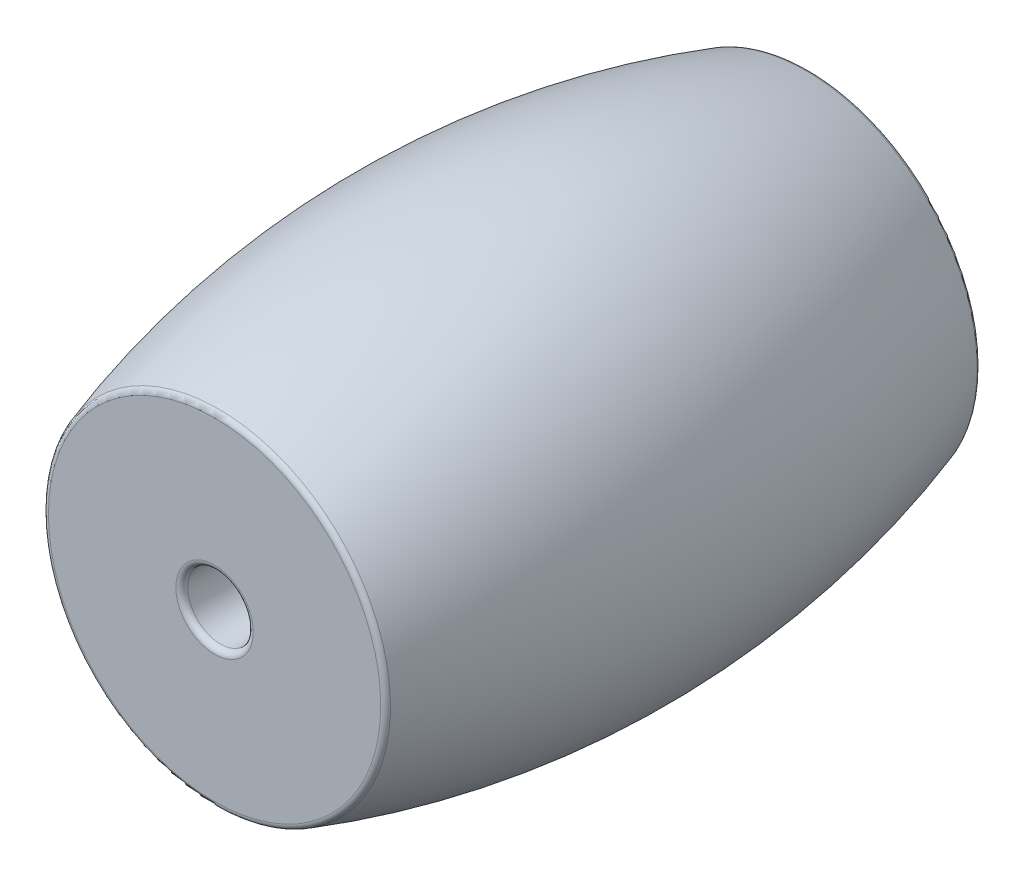
ISO-10303-21;
HEADER;
FILE_DESCRIPTION(('STEP AP214'),'2;1');
FILE_NAME('part.step','',(''),(''),'','','');
FILE_SCHEMA(('AUTOMOTIVE_DESIGN { 1 0 10303 214 1 1 1 1 }'));
ENDSEC;
DATA;
#1=APPLICATION_CONTEXT('core data for automotive mechanical design processes');
#2=APPLICATION_PROTOCOL_DEFINITION('international standard','automotive_design',2000,#1);
#3=PRODUCT_CONTEXT('',#1,'mechanical');
#4=PRODUCT('Part','Part','',(#3));
#5=PRODUCT_RELATED_PRODUCT_CATEGORY('part','',(#4));
#6=PRODUCT_DEFINITION_FORMATION('','',#4);
#7=PRODUCT_DEFINITION_CONTEXT('part definition',#1,'design');
#8=PRODUCT_DEFINITION('design','',#6,#7);
#9=PRODUCT_DEFINITION_SHAPE('','',#8);
#10=(LENGTH_UNIT() NAMED_UNIT(*) SI_UNIT(.MILLI.,.METRE.));
#11=(NAMED_UNIT(*) PLANE_ANGLE_UNIT() SI_UNIT($,.RADIAN.));
#12=(NAMED_UNIT(*) SI_UNIT($,.STERADIAN.) SOLID_ANGLE_UNIT());
#13=UNCERTAINTY_MEASURE_WITH_UNIT(LENGTH_MEASURE(1.E-05),#10,'distance_accuracy_value','');
#14=(GEOMETRIC_REPRESENTATION_CONTEXT(3) GLOBAL_UNCERTAINTY_ASSIGNED_CONTEXT((#13)) GLOBAL_UNIT_ASSIGNED_CONTEXT((#10,
#11,#12)) REPRESENTATION_CONTEXT('',''));
#15=CARTESIAN_POINT('',(0.,0.,0.));
#16=DIRECTION('',(0.,0.,1.));
#17=DIRECTION('',(1.,0.,0.));
#18=AXIS2_PLACEMENT_3D('',#15,#16,#17);
#19=CARTESIAN_POINT('',(0.,0.,-15.));
#20=DIRECTION('',(0.,0.,-1.));
#21=DIRECTION('',(-1.,0.,0.));
#22=AXIS2_PLACEMENT_3D('',#19,#20,#21);
#23=PLANE('',#22);
#24=CARTESIAN_POINT('',(0.,0.,-15.));
#25=DIRECTION('',(0.,0.,-1.));
#26=DIRECTION('',(-1.,0.,0.));
#27=AXIS2_PLACEMENT_3D('',#24,#25,#26);
#28=CIRCLE('',#27,1.95);
#29=CARTESIAN_POINT('',(-1.95,0.,-15.));
#30=VERTEX_POINT('',#29);
#31=EDGE_CURVE('E47',#30,#30,#28,.F.);
#32=ORIENTED_EDGE('',*,*,#31,.T.);
#33=EDGE_LOOP('',(#32));
#34=FACE_BOUND('',#33,.T.);
#35=CARTESIAN_POINT('',(0.,0.,-15.));
#36=DIRECTION('',(0.,0.,-1.));
#37=DIRECTION('',(-1.,0.,0.));
#38=AXIS2_PLACEMENT_3D('',#35,#36,#37);
#39=CIRCLE('',#38,8.3784089628537);
#40=CARTESIAN_POINT('',(-8.3784089628537,0.,-15.));
#41=VERTEX_POINT('',#40);
#42=EDGE_CURVE('E51',#41,#41,#39,.T.);
#43=ORIENTED_EDGE('',*,*,#42,.T.);
#44=EDGE_LOOP('',(#43));
#45=FACE_BOUND('',#44,.T.);
#46=ADVANCED_FACE('F36',(#34,#45),#23,.T.);
#47=CARTESIAN_POINT('',(0.,0.,0.));
#48=DIRECTION('',(0.,0.,1.));
#49=DIRECTION('',(1.,0.,0.));
#50=AXIS2_PLACEMENT_3D('',#47,#48,#49);
#51=DEGENERATE_TOROIDAL_SURFACE('',#50,37.,48.,.F.);
#52=CARTESIAN_POINT('',(0.,0.,-14.7924528301887));
#53=DIRECTION('',(0.,0.,1.));
#54=DIRECTION('',(1.,0.,0.));
#55=AXIS2_PLACEMENT_3D('',#52,#53,#54);
#56=CIRCLE('',#55,8.66380776136221);
#57=CARTESIAN_POINT('',(8.66380776136221,0.,-14.7924528301887));
#58=VERTEX_POINT('',#57);
#59=EDGE_CURVE('E10',#58,#58,#56,.T.);
#60=ORIENTED_EDGE('',*,*,#59,.T.);
#61=EDGE_LOOP('',(#60));
#62=FACE_BOUND('',#61,.T.);
#63=CARTESIAN_POINT('',(0.,0.,14.7924528301887));
#64=DIRECTION('',(0.,0.,-1.));
#65=DIRECTION('',(-1.,0.,0.));
#66=AXIS2_PLACEMENT_3D('',#63,#64,#65);
#67=CIRCLE('',#66,8.66380776136221);
#68=CARTESIAN_POINT('',(-8.66380776136221,0.,14.7924528301887));
#69=VERTEX_POINT('',#68);
#70=EDGE_CURVE('E43',#69,#69,#67,.T.);
#71=ORIENTED_EDGE('',*,*,#70,.T.);
#72=EDGE_LOOP('',(#71));
#73=FACE_BOUND('',#72,.T.);
#74=ADVANCED_FACE('F81',(#62,#73),#51,.F.);
#75=CARTESIAN_POINT('',(0.,0.,15.));
#76=DIRECTION('',(0.,0.,-1.));
#77=DIRECTION('',(-1.,0.,0.));
#78=AXIS2_PLACEMENT_3D('',#75,#76,#77);
#79=PLANE('',#78);
#80=CARTESIAN_POINT('',(0.,0.,15.));
#81=DIRECTION('',(0.,0.,-1.));
#82=DIRECTION('',(-1.,0.,0.));
#83=AXIS2_PLACEMENT_3D('',#80,#81,#82);
#84=CIRCLE('',#83,1.95);
#85=CARTESIAN_POINT('',(-1.95,0.,15.));
#86=VERTEX_POINT('',#85);
#87=EDGE_CURVE('E56',#86,#86,#84,.T.);
#88=ORIENTED_EDGE('',*,*,#87,.T.);
#89=EDGE_LOOP('',(#88));
#90=FACE_BOUND('',#89,.T.);
#91=CARTESIAN_POINT('',(0.,0.,15.));
#92=DIRECTION('',(0.,0.,-1.));
#93=DIRECTION('',(-1.,0.,0.));
#94=AXIS2_PLACEMENT_3D('',#91,#92,#93);
#95=CIRCLE('',#94,8.3784089628537);
#96=CARTESIAN_POINT('',(-8.3784089628537,0.,15.));
#97=VERTEX_POINT('',#96);
#98=EDGE_CURVE('E59',#97,#97,#95,.F.);
#99=ORIENTED_EDGE('',*,*,#98,.T.);
#100=EDGE_LOOP('',(#99));
#101=FACE_BOUND('',#100,.T.);
#102=ADVANCED_FACE('F97',(#90,#101),#79,.F.);
#103=CARTESIAN_POINT('',(0.,0.,31.772981831551));
#104=DIRECTION('',(0.,0.,1.));
#105=DIRECTION('',(1.,0.,0.));
#106=AXIS2_PLACEMENT_3D('',#103,#104,#105);
#107=CYLINDRICAL_SURFACE('',#106,1.65);
#108=CARTESIAN_POINT('',(0.,0.,14.7));
#109=DIRECTION('',(0.,0.,-1.));
#110=DIRECTION('',(-1.,0.,0.));
#111=AXIS2_PLACEMENT_3D('',#108,#109,#110);
#112=CIRCLE('',#111,1.65);
#113=CARTESIAN_POINT('',(-1.65,0.,14.7));
#114=VERTEX_POINT('',#113);
#115=EDGE_CURVE('E62',#114,#114,#112,.F.);
#116=ORIENTED_EDGE('',*,*,#115,.T.);
#117=EDGE_LOOP('',(#116));
#118=FACE_BOUND('',#117,.T.);
#119=CARTESIAN_POINT('',(0.,0.,-14.7));
#120=DIRECTION('',(0.,0.,-1.));
#121=DIRECTION('',(-1.,0.,0.));
#122=AXIS2_PLACEMENT_3D('',#119,#120,#121);
#123=CIRCLE('',#122,1.65);
#124=CARTESIAN_POINT('',(-1.65,0.,-14.7));
#125=VERTEX_POINT('',#124);
#126=EDGE_CURVE('E65',#125,#125,#123,.T.);
#127=ORIENTED_EDGE('',*,*,#126,.T.);
#128=EDGE_LOOP('',(#127));
#129=FACE_BOUND('',#128,.T.);
#130=ADVANCED_FACE('F69',(#118,#129),#107,.F.);
#131=CARTESIAN_POINT('',(0.,0.,14.7));
#132=DIRECTION('',(0.,0.,-1.));
#133=DIRECTION('',(-1.,0.,0.));
#134=AXIS2_PLACEMENT_3D('',#131,#132,#133);
#135=TOROIDAL_SURFACE('',#134,1.95,0.3);
#136=ORIENTED_EDGE('',*,*,#87,.F.);
#137=EDGE_LOOP('',(#136));
#138=FACE_BOUND('',#137,.T.);
#139=ORIENTED_EDGE('',*,*,#115,.F.);
#140=EDGE_LOOP('',(#139));
#141=FACE_BOUND('',#140,.T.);
#142=ADVANCED_FACE('F75',(#138,#141),#135,.T.);
#143=CARTESIAN_POINT('',(0.,0.,-14.7));
#144=DIRECTION('',(0.,0.,-1.));
#145=DIRECTION('',(-1.,0.,0.));
#146=AXIS2_PLACEMENT_3D('',#143,#144,#145);
#147=TOROIDAL_SURFACE('',#146,1.95,0.3);
#148=ORIENTED_EDGE('',*,*,#126,.F.);
#149=EDGE_LOOP('',(#148));
#150=FACE_BOUND('',#149,.T.);
#151=ORIENTED_EDGE('',*,*,#31,.F.);
#152=EDGE_LOOP('',(#151));
#153=FACE_BOUND('',#152,.T.);
#154=ADVANCED_FACE('F71',(#150,#153),#147,.T.);
#155=CARTESIAN_POINT('',(0.,0.,-14.7));
#156=DIRECTION('',(0.,0.,-1.));
#157=DIRECTION('',(-1.,0.,0.));
#158=AXIS2_PLACEMENT_3D('',#155,#156,#157);
#159=TOROIDAL_SURFACE('',#158,8.3784089628537,0.3);
#160=ORIENTED_EDGE('',*,*,#42,.F.);
#161=EDGE_LOOP('',(#160));
#162=FACE_BOUND('',#161,.T.);
#163=ORIENTED_EDGE('',*,*,#59,.F.);
#164=EDGE_LOOP('',(#163));
#165=FACE_BOUND('',#164,.T.);
#166=ADVANCED_FACE('F74',(#162,#165),#159,.T.);
#167=CARTESIAN_POINT('',(0.,0.,14.7));
#168=DIRECTION('',(0.,0.,-1.));
#169=DIRECTION('',(-1.,0.,0.));
#170=AXIS2_PLACEMENT_3D('',#167,#168,#169);
#171=TOROIDAL_SURFACE('',#170,8.3784089628537,0.3);
#172=ORIENTED_EDGE('',*,*,#70,.F.);
#173=EDGE_LOOP('',(#172));
#174=FACE_BOUND('',#173,.T.);
#175=ORIENTED_EDGE('',*,*,#98,.F.);
#176=EDGE_LOOP('',(#175));
#177=FACE_BOUND('',#176,.T.);
#178=ADVANCED_FACE('F38',(#174,#177),#171,.T.);
#179=CLOSED_SHELL('',(#46,#74,#102,#130,#142,#154,#166,#178));
#180=MANIFOLD_SOLID_BREP('B2',#179);
#181=ADVANCED_BREP_SHAPE_REPRESENTATION('',(#18,#180),#14);
#182=SHAPE_DEFINITION_REPRESENTATION(#9,#181);
ENDSEC;
END-ISO-10303-21;
